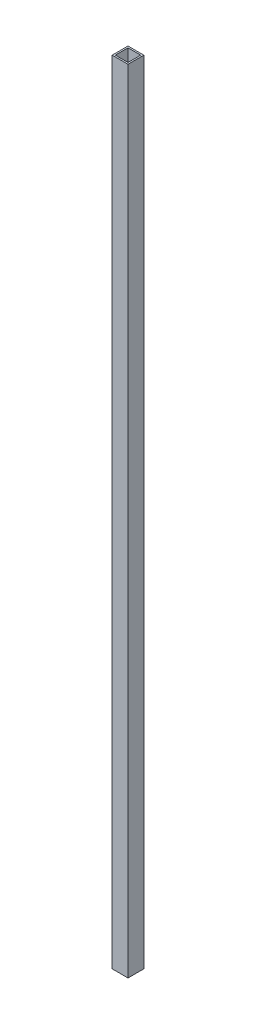
ISO-10303-21;
HEADER;
FILE_DESCRIPTION(('STEP AP214'),'2;1');
FILE_NAME('part.step','',(''),(''),'','','');
FILE_SCHEMA(('AUTOMOTIVE_DESIGN { 1 0 10303 214 1 1 1 1 }'));
ENDSEC;
DATA;
#1=APPLICATION_CONTEXT('core data for automotive mechanical design processes');
#2=APPLICATION_PROTOCOL_DEFINITION('international standard','automotive_design',2000,#1);
#3=PRODUCT_CONTEXT('',#1,'mechanical');
#4=PRODUCT('Part','Part','',(#3));
#5=PRODUCT_RELATED_PRODUCT_CATEGORY('part','',(#4));
#6=PRODUCT_DEFINITION_FORMATION('','',#4);
#7=PRODUCT_DEFINITION_CONTEXT('part definition',#1,'design');
#8=PRODUCT_DEFINITION('design','',#6,#7);
#9=PRODUCT_DEFINITION_SHAPE('','',#8);
#10=(LENGTH_UNIT() NAMED_UNIT(*) SI_UNIT(.MILLI.,.METRE.));
#11=(NAMED_UNIT(*) PLANE_ANGLE_UNIT() SI_UNIT($,.RADIAN.));
#12=(NAMED_UNIT(*) SI_UNIT($,.STERADIAN.) SOLID_ANGLE_UNIT());
#13=UNCERTAINTY_MEASURE_WITH_UNIT(LENGTH_MEASURE(1.E-05),#10,'distance_accuracy_value','');
#14=(GEOMETRIC_REPRESENTATION_CONTEXT(3) GLOBAL_UNCERTAINTY_ASSIGNED_CONTEXT((#13)) GLOBAL_UNIT_ASSIGNED_CONTEXT((#10,
#11,#12)) REPRESENTATION_CONTEXT('',''));
#15=CARTESIAN_POINT('',(0.,0.,0.));
#16=DIRECTION('',(0.,0.,1.));
#17=DIRECTION('',(1.,0.,0.));
#18=AXIS2_PLACEMENT_3D('',#15,#16,#17);
#19=CARTESIAN_POINT('',(0.,1000.,0.));
#20=DIRECTION('',(0.,-1.,0.));
#21=DIRECTION('',(0.,0.,-1.));
#22=AXIS2_PLACEMENT_3D('',#19,#20,#21);
#23=PLANE('',#22);
#24=DIRECTION('',(0.,0.,1.));
#25=VECTOR('',#24,1.);
#26=CARTESIAN_POINT('',(0.,1000.,0.));
#27=LINE('',#26,#25);
#28=CARTESIAN_POINT('',(0.,1000.,-20.));
#29=VERTEX_POINT('',#28);
#30=CARTESIAN_POINT('',(0.,1000.,0.));
#31=VERTEX_POINT('',#30);
#32=EDGE_CURVE('E134',#29,#31,#27,.T.);
#33=ORIENTED_EDGE('',*,*,#32,.T.);
#34=DIRECTION('',(1.,0.,0.));
#35=VECTOR('',#34,1.);
#36=CARTESIAN_POINT('',(0.,1000.,0.));
#37=LINE('',#36,#35);
#38=CARTESIAN_POINT('',(20.,1000.,0.));
#39=VERTEX_POINT('',#38);
#40=EDGE_CURVE('E137',#31,#39,#37,.T.);
#41=ORIENTED_EDGE('',*,*,#40,.T.);
#42=DIRECTION('',(0.,0.,-1.));
#43=VECTOR('',#42,1.);
#44=CARTESIAN_POINT('',(20.,1000.,0.));
#45=LINE('',#44,#43);
#46=CARTESIAN_POINT('',(20.,1000.,-20.));
#47=VERTEX_POINT('',#46);
#48=EDGE_CURVE('E140',#39,#47,#45,.T.);
#49=ORIENTED_EDGE('',*,*,#48,.T.);
#50=DIRECTION('',(-1.,0.,0.));
#51=VECTOR('',#50,1.);
#52=CARTESIAN_POINT('',(0.,1000.,-20.));
#53=LINE('',#52,#51);
#54=EDGE_CURVE('E142',#47,#29,#53,.T.);
#55=ORIENTED_EDGE('',*,*,#54,.T.);
#56=EDGE_LOOP('',(#33,#41,#49,#55));
#57=FACE_BOUND('',#56,.T.);
#58=DIRECTION('',(1.,0.,0.));
#59=VECTOR('',#58,1.);
#60=CARTESIAN_POINT('',(2.,1000.,-2.));
#61=LINE('',#60,#59);
#62=CARTESIAN_POINT('',(2.,1000.,-2.));
#63=VERTEX_POINT('',#62);
#64=CARTESIAN_POINT('',(18.,1000.,-2.));
#65=VERTEX_POINT('',#64);
#66=EDGE_CURVE('E98',#63,#65,#61,.T.);
#67=ORIENTED_EDGE('',*,*,#66,.F.);
#68=DIRECTION('',(0.,0.,1.));
#69=VECTOR('',#68,1.);
#70=CARTESIAN_POINT('',(2.,1000.,-2.));
#71=LINE('',#70,#69);
#72=CARTESIAN_POINT('',(2.,1000.,-18.));
#73=VERTEX_POINT('',#72);
#74=EDGE_CURVE('E120',#73,#63,#71,.T.);
#75=ORIENTED_EDGE('',*,*,#74,.F.);
#76=DIRECTION('',(-1.,0.,0.));
#77=VECTOR('',#76,1.);
#78=CARTESIAN_POINT('',(2.,1000.,-18.));
#79=LINE('',#78,#77);
#80=CARTESIAN_POINT('',(18.,1000.,-18.));
#81=VERTEX_POINT('',#80);
#82=EDGE_CURVE('E118',#81,#73,#79,.T.);
#83=ORIENTED_EDGE('',*,*,#82,.F.);
#84=DIRECTION('',(0.,0.,-1.));
#85=VECTOR('',#84,1.);
#86=CARTESIAN_POINT('',(18.,1000.,-2.));
#87=LINE('',#86,#85);
#88=EDGE_CURVE('E106',#65,#81,#87,.T.);
#89=ORIENTED_EDGE('',*,*,#88,.F.);
#90=EDGE_LOOP('',(#67,#75,#83,#89));
#91=FACE_BOUND('',#90,.T.);
#92=ADVANCED_FACE('F33',(#57,#91),#23,.F.);
#93=CARTESIAN_POINT('',(0.,0.,0.));
#94=DIRECTION('',(0.,-1.,0.));
#95=DIRECTION('',(0.,0.,-1.));
#96=AXIS2_PLACEMENT_3D('',#93,#94,#95);
#97=PLANE('',#96);
#98=DIRECTION('',(0.,0.,1.));
#99=VECTOR('',#98,1.);
#100=CARTESIAN_POINT('',(0.,0.,0.));
#101=LINE('',#100,#99);
#102=CARTESIAN_POINT('',(0.,0.,-20.));
#103=VERTEX_POINT('',#102);
#104=CARTESIAN_POINT('',(0.,0.,0.));
#105=VERTEX_POINT('',#104);
#106=EDGE_CURVE('E114',#103,#105,#101,.T.);
#107=ORIENTED_EDGE('',*,*,#106,.F.);
#108=DIRECTION('',(-1.,0.,0.));
#109=VECTOR('',#108,1.);
#110=CARTESIAN_POINT('',(0.,0.,-20.));
#111=LINE('',#110,#109);
#112=CARTESIAN_POINT('',(20.,0.,-20.));
#113=VERTEX_POINT('',#112);
#114=EDGE_CURVE('E138',#113,#103,#111,.T.);
#115=ORIENTED_EDGE('',*,*,#114,.F.);
#116=DIRECTION('',(0.,0.,-1.));
#117=VECTOR('',#116,1.);
#118=CARTESIAN_POINT('',(20.,0.,0.));
#119=LINE('',#118,#117);
#120=CARTESIAN_POINT('',(20.,0.,0.));
#121=VERTEX_POINT('',#120);
#122=EDGE_CURVE('E149',#121,#113,#119,.T.);
#123=ORIENTED_EDGE('',*,*,#122,.F.);
#124=DIRECTION('',(1.,0.,0.));
#125=VECTOR('',#124,1.);
#126=CARTESIAN_POINT('',(0.,0.,0.));
#127=LINE('',#126,#125);
#128=EDGE_CURVE('E147',#105,#121,#127,.T.);
#129=ORIENTED_EDGE('',*,*,#128,.F.);
#130=EDGE_LOOP('',(#107,#115,#123,#129));
#131=FACE_BOUND('',#130,.T.);
#132=DIRECTION('',(0.,0.,1.));
#133=VECTOR('',#132,1.);
#134=CARTESIAN_POINT('',(2.,0.,-2.));
#135=LINE('',#134,#133);
#136=CARTESIAN_POINT('',(2.,0.,-18.));
#137=VERTEX_POINT('',#136);
#138=CARTESIAN_POINT('',(2.,0.,-2.));
#139=VERTEX_POINT('',#138);
#140=EDGE_CURVE('E107',#137,#139,#135,.T.);
#141=ORIENTED_EDGE('',*,*,#140,.T.);
#142=DIRECTION('',(1.,0.,0.));
#143=VECTOR('',#142,1.);
#144=CARTESIAN_POINT('',(2.,0.,-2.));
#145=LINE('',#144,#143);
#146=CARTESIAN_POINT('',(18.,0.,-2.));
#147=VERTEX_POINT('',#146);
#148=EDGE_CURVE('E56',#139,#147,#145,.T.);
#149=ORIENTED_EDGE('',*,*,#148,.T.);
#150=DIRECTION('',(0.,0.,-1.));
#151=VECTOR('',#150,1.);
#152=CARTESIAN_POINT('',(18.,0.,-2.));
#153=LINE('',#152,#151);
#154=CARTESIAN_POINT('',(18.,0.,-18.));
#155=VERTEX_POINT('',#154);
#156=EDGE_CURVE('E113',#147,#155,#153,.T.);
#157=ORIENTED_EDGE('',*,*,#156,.T.);
#158=DIRECTION('',(-1.,0.,0.));
#159=VECTOR('',#158,1.);
#160=CARTESIAN_POINT('',(2.,0.,-18.));
#161=LINE('',#160,#159);
#162=EDGE_CURVE('E126',#155,#137,#161,.T.);
#163=ORIENTED_EDGE('',*,*,#162,.T.);
#164=EDGE_LOOP('',(#141,#149,#157,#163));
#165=FACE_BOUND('',#164,.T.);
#166=ADVANCED_FACE('F167',(#131,#165),#97,.T.);
#167=CARTESIAN_POINT('',(0.,1000.,0.));
#168=DIRECTION('',(1.,0.,0.));
#169=DIRECTION('',(0.,0.,-1.));
#170=AXIS2_PLACEMENT_3D('',#167,#168,#169);
#171=PLANE('',#170);
#172=ORIENTED_EDGE('',*,*,#106,.T.);
#173=DIRECTION('',(0.,-1.,0.));
#174=VECTOR('',#173,1.);
#175=CARTESIAN_POINT('',(0.,1000.,0.));
#176=LINE('',#175,#174);
#177=EDGE_CURVE('E11',#31,#105,#176,.T.);
#178=ORIENTED_EDGE('',*,*,#177,.F.);
#179=ORIENTED_EDGE('',*,*,#32,.F.);
#180=DIRECTION('',(0.,-1.,0.));
#181=VECTOR('',#180,1.);
#182=CARTESIAN_POINT('',(0.,1000.,-20.));
#183=LINE('',#182,#181);
#184=EDGE_CURVE('E144',#29,#103,#183,.T.);
#185=ORIENTED_EDGE('',*,*,#184,.T.);
#186=EDGE_LOOP('',(#172,#178,#179,#185));
#187=FACE_BOUND('',#186,.T.);
#188=ADVANCED_FACE('F35',(#187),#171,.F.);
#189=CARTESIAN_POINT('',(0.,1000.,0.));
#190=DIRECTION('',(0.,0.,-1.));
#191=DIRECTION('',(-1.,0.,0.));
#192=AXIS2_PLACEMENT_3D('',#189,#190,#191);
#193=PLANE('',#192);
#194=ORIENTED_EDGE('',*,*,#128,.T.);
#195=DIRECTION('',(0.,-1.,0.));
#196=VECTOR('',#195,1.);
#197=CARTESIAN_POINT('',(20.,1000.,0.));
#198=LINE('',#197,#196);
#199=EDGE_CURVE('E41',#39,#121,#198,.T.);
#200=ORIENTED_EDGE('',*,*,#199,.F.);
#201=ORIENTED_EDGE('',*,*,#40,.F.);
#202=ORIENTED_EDGE('',*,*,#177,.T.);
#203=EDGE_LOOP('',(#194,#200,#201,#202));
#204=FACE_BOUND('',#203,.T.);
#205=ADVANCED_FACE('F177',(#204),#193,.F.);
#206=CARTESIAN_POINT('',(20.,1000.,0.));
#207=DIRECTION('',(-1.,0.,0.));
#208=DIRECTION('',(0.,0.,1.));
#209=AXIS2_PLACEMENT_3D('',#206,#207,#208);
#210=PLANE('',#209);
#211=ORIENTED_EDGE('',*,*,#122,.T.);
#212=DIRECTION('',(0.,-1.,0.));
#213=VECTOR('',#212,1.);
#214=CARTESIAN_POINT('',(20.,1000.,-20.));
#215=LINE('',#214,#213);
#216=EDGE_CURVE('E154',#47,#113,#215,.T.);
#217=ORIENTED_EDGE('',*,*,#216,.F.);
#218=ORIENTED_EDGE('',*,*,#48,.F.);
#219=ORIENTED_EDGE('',*,*,#199,.T.);
#220=EDGE_LOOP('',(#211,#217,#218,#219));
#221=FACE_BOUND('',#220,.T.);
#222=ADVANCED_FACE('F161',(#221),#210,.F.);
#223=CARTESIAN_POINT('',(0.,1000.,-20.));
#224=DIRECTION('',(0.,0.,1.));
#225=DIRECTION('',(1.,0.,0.));
#226=AXIS2_PLACEMENT_3D('',#223,#224,#225);
#227=PLANE('',#226);
#228=ORIENTED_EDGE('',*,*,#114,.T.);
#229=ORIENTED_EDGE('',*,*,#184,.F.);
#230=ORIENTED_EDGE('',*,*,#54,.F.);
#231=ORIENTED_EDGE('',*,*,#216,.T.);
#232=EDGE_LOOP('',(#228,#229,#230,#231));
#233=FACE_BOUND('',#232,.T.);
#234=ADVANCED_FACE('F171',(#233),#227,.F.);
#235=CARTESIAN_POINT('',(2.,1000.,-2.));
#236=DIRECTION('',(0.,0.,-1.));
#237=DIRECTION('',(-1.,0.,0.));
#238=AXIS2_PLACEMENT_3D('',#235,#236,#237);
#239=PLANE('',#238);
#240=ORIENTED_EDGE('',*,*,#148,.F.);
#241=DIRECTION('',(0.,-1.,0.));
#242=VECTOR('',#241,1.);
#243=CARTESIAN_POINT('',(2.,1000.,-2.));
#244=LINE('',#243,#242);
#245=EDGE_CURVE('E102',#63,#139,#244,.T.);
#246=ORIENTED_EDGE('',*,*,#245,.F.);
#247=ORIENTED_EDGE('',*,*,#66,.T.);
#248=DIRECTION('',(0.,-1.,0.));
#249=VECTOR('',#248,1.);
#250=CARTESIAN_POINT('',(18.,1000.,-2.));
#251=LINE('',#250,#249);
#252=EDGE_CURVE('E101',#65,#147,#251,.T.);
#253=ORIENTED_EDGE('',*,*,#252,.T.);
#254=EDGE_LOOP('',(#240,#246,#247,#253));
#255=FACE_BOUND('',#254,.T.);
#256=ADVANCED_FACE('F100',(#255),#239,.T.);
#257=CARTESIAN_POINT('',(18.,1000.,-2.));
#258=DIRECTION('',(-1.,0.,0.));
#259=DIRECTION('',(0.,0.,1.));
#260=AXIS2_PLACEMENT_3D('',#257,#258,#259);
#261=PLANE('',#260);
#262=ORIENTED_EDGE('',*,*,#156,.F.);
#263=ORIENTED_EDGE('',*,*,#252,.F.);
#264=ORIENTED_EDGE('',*,*,#88,.T.);
#265=DIRECTION('',(0.,-1.,0.));
#266=VECTOR('',#265,1.);
#267=CARTESIAN_POINT('',(18.,1000.,-18.));
#268=LINE('',#267,#266);
#269=EDGE_CURVE('E115',#81,#155,#268,.T.);
#270=ORIENTED_EDGE('',*,*,#269,.T.);
#271=EDGE_LOOP('',(#262,#263,#264,#270));
#272=FACE_BOUND('',#271,.T.);
#273=ADVANCED_FACE('F110',(#272),#261,.T.);
#274=CARTESIAN_POINT('',(2.,1000.,-18.));
#275=DIRECTION('',(0.,0.,1.));
#276=DIRECTION('',(1.,0.,0.));
#277=AXIS2_PLACEMENT_3D('',#274,#275,#276);
#278=PLANE('',#277);
#279=ORIENTED_EDGE('',*,*,#162,.F.);
#280=ORIENTED_EDGE('',*,*,#269,.F.);
#281=ORIENTED_EDGE('',*,*,#82,.T.);
#282=DIRECTION('',(0.,-1.,0.));
#283=VECTOR('',#282,1.);
#284=CARTESIAN_POINT('',(2.,1000.,-18.));
#285=LINE('',#284,#283);
#286=EDGE_CURVE('E48',#73,#137,#285,.T.);
#287=ORIENTED_EDGE('',*,*,#286,.T.);
#288=EDGE_LOOP('',(#279,#280,#281,#287));
#289=FACE_BOUND('',#288,.T.);
#290=ADVANCED_FACE('F200',(#289),#278,.T.);
#291=CARTESIAN_POINT('',(2.,1000.,-2.));
#292=DIRECTION('',(1.,0.,0.));
#293=DIRECTION('',(0.,0.,-1.));
#294=AXIS2_PLACEMENT_3D('',#291,#292,#293);
#295=PLANE('',#294);
#296=ORIENTED_EDGE('',*,*,#140,.F.);
#297=ORIENTED_EDGE('',*,*,#286,.F.);
#298=ORIENTED_EDGE('',*,*,#74,.T.);
#299=ORIENTED_EDGE('',*,*,#245,.T.);
#300=EDGE_LOOP('',(#296,#297,#298,#299));
#301=FACE_BOUND('',#300,.T.);
#302=ADVANCED_FACE('F204',(#301),#295,.T.);
#303=CLOSED_SHELL('',(#92,#166,#188,#205,#222,#234,#256,#273,#290,#302));
#304=MANIFOLD_SOLID_BREP('B2',#303);
#305=ADVANCED_BREP_SHAPE_REPRESENTATION('',(#18,#304),#14);
#306=SHAPE_DEFINITION_REPRESENTATION(#9,#305);
ENDSEC;
END-ISO-10303-21;
